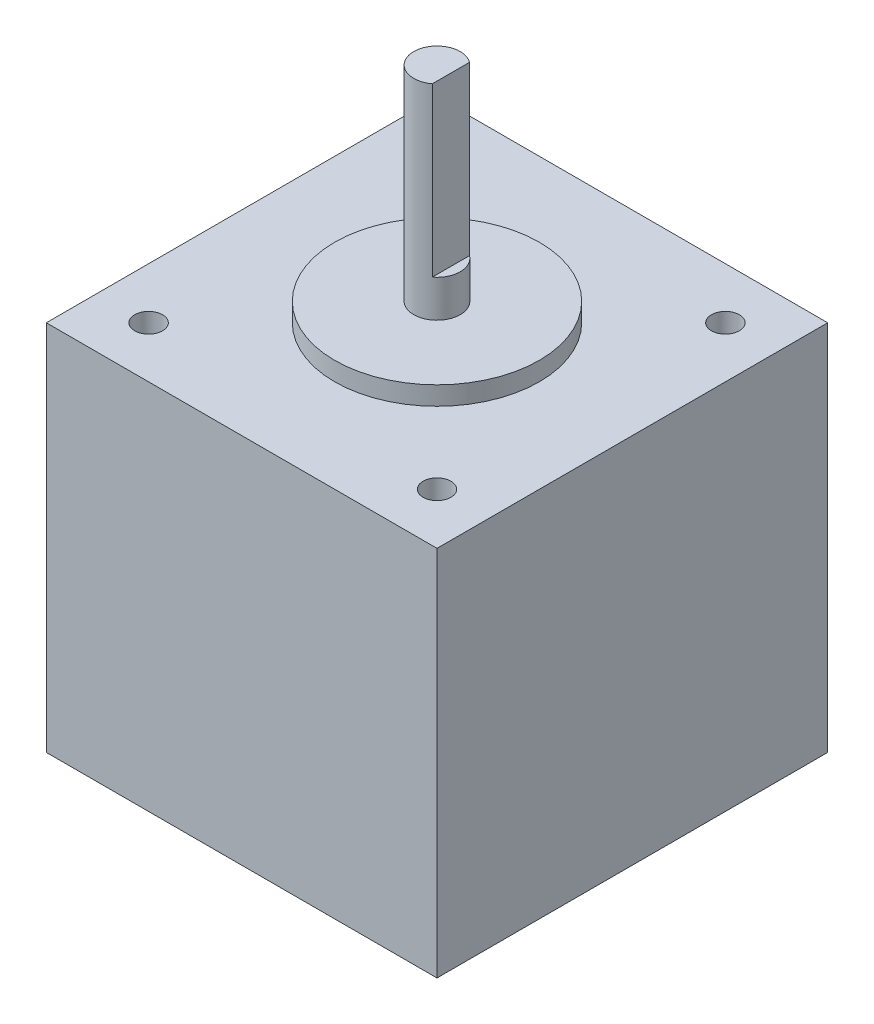
ISO-10303-21;
HEADER;
FILE_DESCRIPTION(('STEP AP214'),'2;1');
FILE_NAME('part.step','',(''),(''),'','','');
FILE_SCHEMA(('AUTOMOTIVE_DESIGN { 1 0 10303 214 1 1 1 1 }'));
ENDSEC;
DATA;
#1=APPLICATION_CONTEXT('core data for automotive mechanical design processes');
#2=APPLICATION_PROTOCOL_DEFINITION('international standard','automotive_design',2000,#1);
#3=PRODUCT_CONTEXT('',#1,'mechanical');
#4=PRODUCT('Part','Part','',(#3));
#5=PRODUCT_RELATED_PRODUCT_CATEGORY('part','',(#4));
#6=PRODUCT_DEFINITION_FORMATION('','',#4);
#7=PRODUCT_DEFINITION_CONTEXT('part definition',#1,'design');
#8=PRODUCT_DEFINITION('design','',#6,#7);
#9=PRODUCT_DEFINITION_SHAPE('','',#8);
#10=(LENGTH_UNIT() NAMED_UNIT(*) SI_UNIT(.MILLI.,.METRE.));
#11=(NAMED_UNIT(*) PLANE_ANGLE_UNIT() SI_UNIT($,.RADIAN.));
#12=(NAMED_UNIT(*) SI_UNIT($,.STERADIAN.) SOLID_ANGLE_UNIT());
#13=UNCERTAINTY_MEASURE_WITH_UNIT(LENGTH_MEASURE(1.E-05),#10,'distance_accuracy_value','');
#14=(GEOMETRIC_REPRESENTATION_CONTEXT(3) GLOBAL_UNCERTAINTY_ASSIGNED_CONTEXT((#13)) GLOBAL_UNIT_ASSIGNED_CONTEXT((#10,
#11,#12)) REPRESENTATION_CONTEXT('',''));
#15=CARTESIAN_POINT('',(0.,0.,0.));
#16=DIRECTION('',(0.,0.,1.));
#17=DIRECTION('',(1.,0.,0.));
#18=AXIS2_PLACEMENT_3D('',#15,#16,#17);
#19=CARTESIAN_POINT('',(21.,64.,-21.));
#20=DIRECTION('',(0.,-1.,0.));
#21=DIRECTION('',(0.,0.,-1.));
#22=AXIS2_PLACEMENT_3D('',#19,#20,#21);
#23=CYLINDRICAL_SURFACE('',#22,2.5);
#24=CARTESIAN_POINT('',(21.,42.,-21.));
#25=DIRECTION('',(0.,1.,0.));
#26=DIRECTION('',(0.,0.,1.));
#27=AXIS2_PLACEMENT_3D('',#24,#25,#26);
#28=CIRCLE('',#27,2.5);
#29=CARTESIAN_POINT('',(21.,42.,-18.5));
#30=VERTEX_POINT('',#29);
#31=EDGE_CURVE('E11',#30,#30,#28,.T.);
#32=ORIENTED_EDGE('',*,*,#31,.T.);
#33=EDGE_LOOP('',(#32));
#34=FACE_BOUND('',#33,.T.);
#35=DIRECTION('',(0.,1.,0.));
#36=VECTOR('',#35,1.);
#37=CARTESIAN_POINT('',(22.5,46.,-19.));
#38=LINE('',#37,#36);
#39=CARTESIAN_POINT('',(22.5,46.,-19.));
#40=VERTEX_POINT('',#39);
#41=CARTESIAN_POINT('',(22.5,64.,-19.));
#42=VERTEX_POINT('',#41);
#43=EDGE_CURVE('E103',#40,#42,#38,.T.);
#44=ORIENTED_EDGE('',*,*,#43,.T.);
#45=CARTESIAN_POINT('',(21.,64.,-21.));
#46=DIRECTION('',(0.,1.,0.));
#47=DIRECTION('',(0.,0.,1.));
#48=AXIS2_PLACEMENT_3D('',#45,#46,#47);
#49=CIRCLE('',#48,2.5);
#50=CARTESIAN_POINT('',(22.5,64.,-23.));
#51=VERTEX_POINT('',#50);
#52=EDGE_CURVE('E126',#51,#42,#49,.T.);
#53=ORIENTED_EDGE('',*,*,#52,.F.);
#54=DIRECTION('',(0.,1.,0.));
#55=VECTOR('',#54,1.);
#56=CARTESIAN_POINT('',(22.5,46.,-23.));
#57=LINE('',#56,#55);
#58=CARTESIAN_POINT('',(22.5,46.,-23.));
#59=VERTEX_POINT('',#58);
#60=EDGE_CURVE('E57',#59,#51,#57,.T.);
#61=ORIENTED_EDGE('',*,*,#60,.F.);
#62=CARTESIAN_POINT('',(21.,46.,-21.));
#63=DIRECTION('',(0.,1.,0.));
#64=DIRECTION('',(0.,0.,1.));
#65=AXIS2_PLACEMENT_3D('',#62,#63,#64);
#66=CIRCLE('',#65,2.5);
#67=EDGE_CURVE('E114',#40,#59,#66,.T.);
#68=ORIENTED_EDGE('',*,*,#67,.F.);
#69=EDGE_LOOP('',(#44,#53,#61,#68));
#70=FACE_BOUND('',#69,.T.);
#71=ADVANCED_FACE('F39',(#34,#70),#23,.T.);
#72=CARTESIAN_POINT('',(21.,64.,-21.));
#73=DIRECTION('',(0.,1.,0.));
#74=DIRECTION('',(0.,0.,1.));
#75=AXIS2_PLACEMENT_3D('',#72,#73,#74);
#76=PLANE('',#75);
#77=ORIENTED_EDGE('',*,*,#52,.T.);
#78=DIRECTION('',(0.,0.,-1.));
#79=VECTOR('',#78,1.);
#80=CARTESIAN_POINT('',(22.5,64.,0.));
#81=LINE('',#80,#79);
#82=EDGE_CURVE('E108',#42,#51,#81,.T.);
#83=ORIENTED_EDGE('',*,*,#82,.T.);
#84=EDGE_LOOP('',(#77,#83));
#85=FACE_BOUND('',#84,.T.);
#86=ADVANCED_FACE('F228',(#85),#76,.T.);
#87=CARTESIAN_POINT('',(42.,40.,0.));
#88=DIRECTION('',(0.,0.,-1.));
#89=DIRECTION('',(-1.,0.,0.));
#90=AXIS2_PLACEMENT_3D('',#87,#88,#89);
#91=PLANE('',#90);
#92=DIRECTION('',(1.,0.,0.));
#93=VECTOR('',#92,1.);
#94=CARTESIAN_POINT('',(42.,0.,0.));
#95=LINE('',#94,#93);
#96=CARTESIAN_POINT('',(0.,0.,0.));
#97=VERTEX_POINT('',#96);
#98=CARTESIAN_POINT('',(42.,0.,0.));
#99=VERTEX_POINT('',#98);
#100=EDGE_CURVE('E166',#97,#99,#95,.T.);
#101=ORIENTED_EDGE('',*,*,#100,.T.);
#102=DIRECTION('',(0.,-1.,0.));
#103=VECTOR('',#102,1.);
#104=CARTESIAN_POINT('',(42.,40.,0.));
#105=LINE('',#104,#103);
#106=CARTESIAN_POINT('',(42.,40.,0.));
#107=VERTEX_POINT('',#106);
#108=EDGE_CURVE('E43',#107,#99,#105,.T.);
#109=ORIENTED_EDGE('',*,*,#108,.F.);
#110=DIRECTION('',(1.,0.,0.));
#111=VECTOR('',#110,1.);
#112=CARTESIAN_POINT('',(42.,40.,0.));
#113=LINE('',#112,#111);
#114=CARTESIAN_POINT('',(0.,40.,0.));
#115=VERTEX_POINT('',#114);
#116=EDGE_CURVE('E170',#115,#107,#113,.T.);
#117=ORIENTED_EDGE('',*,*,#116,.F.);
#118=DIRECTION('',(0.,-1.,0.));
#119=VECTOR('',#118,1.);
#120=CARTESIAN_POINT('',(0.,40.,0.));
#121=LINE('',#120,#119);
#122=EDGE_CURVE('E180',#115,#97,#121,.T.);
#123=ORIENTED_EDGE('',*,*,#122,.T.);
#124=EDGE_LOOP('',(#101,#109,#117,#123));
#125=FACE_BOUND('',#124,.T.);
#126=ADVANCED_FACE('F41',(#125),#91,.F.);
#127=CARTESIAN_POINT('',(42.,40.,-42.));
#128=DIRECTION('',(-1.,0.,0.));
#129=DIRECTION('',(0.,0.,1.));
#130=AXIS2_PLACEMENT_3D('',#127,#128,#129);
#131=PLANE('',#130);
#132=DIRECTION('',(0.,0.,-1.));
#133=VECTOR('',#132,1.);
#134=CARTESIAN_POINT('',(42.,0.,-42.));
#135=LINE('',#134,#133);
#136=CARTESIAN_POINT('',(42.,0.,-42.));
#137=VERTEX_POINT('',#136);
#138=EDGE_CURVE('E184',#99,#137,#135,.T.);
#139=ORIENTED_EDGE('',*,*,#138,.T.);
#140=DIRECTION('',(0.,-1.,0.));
#141=VECTOR('',#140,1.);
#142=CARTESIAN_POINT('',(42.,40.,-42.));
#143=LINE('',#142,#141);
#144=CARTESIAN_POINT('',(42.,40.,-42.));
#145=VERTEX_POINT('',#144);
#146=EDGE_CURVE('E196',#145,#137,#143,.T.);
#147=ORIENTED_EDGE('',*,*,#146,.F.);
#148=DIRECTION('',(0.,0.,-1.));
#149=VECTOR('',#148,1.);
#150=CARTESIAN_POINT('',(42.,40.,-42.));
#151=LINE('',#150,#149);
#152=EDGE_CURVE('E95',#107,#145,#151,.T.);
#153=ORIENTED_EDGE('',*,*,#152,.F.);
#154=ORIENTED_EDGE('',*,*,#108,.T.);
#155=EDGE_LOOP('',(#139,#147,#153,#154));
#156=FACE_BOUND('',#155,.T.);
#157=ADVANCED_FACE('F204',(#156),#131,.F.);
#158=CARTESIAN_POINT('',(0.,40.,-42.));
#159=DIRECTION('',(0.,0.,1.));
#160=DIRECTION('',(1.,0.,0.));
#161=AXIS2_PLACEMENT_3D('',#158,#159,#160);
#162=PLANE('',#161);
#163=DIRECTION('',(-1.,0.,0.));
#164=VECTOR('',#163,1.);
#165=CARTESIAN_POINT('',(0.,0.,-42.));
#166=LINE('',#165,#164);
#167=CARTESIAN_POINT('',(0.,0.,-42.));
#168=VERTEX_POINT('',#167);
#169=EDGE_CURVE('E187',#137,#168,#166,.T.);
#170=ORIENTED_EDGE('',*,*,#169,.T.);
#171=DIRECTION('',(0.,-1.,0.));
#172=VECTOR('',#171,1.);
#173=CARTESIAN_POINT('',(0.,40.,-42.));
#174=LINE('',#173,#172);
#175=CARTESIAN_POINT('',(0.,40.,-42.));
#176=VERTEX_POINT('',#175);
#177=EDGE_CURVE('E194',#176,#168,#174,.T.);
#178=ORIENTED_EDGE('',*,*,#177,.F.);
#179=DIRECTION('',(-1.,0.,0.));
#180=VECTOR('',#179,1.);
#181=CARTESIAN_POINT('',(0.,40.,-42.));
#182=LINE('',#181,#180);
#183=EDGE_CURVE('E175',#145,#176,#182,.T.);
#184=ORIENTED_EDGE('',*,*,#183,.F.);
#185=ORIENTED_EDGE('',*,*,#146,.T.);
#186=EDGE_LOOP('',(#170,#178,#184,#185));
#187=FACE_BOUND('',#186,.T.);
#188=ADVANCED_FACE('F211',(#187),#162,.F.);
#189=CARTESIAN_POINT('',(0.,40.,0.));
#190=DIRECTION('',(1.,0.,0.));
#191=DIRECTION('',(0.,0.,-1.));
#192=AXIS2_PLACEMENT_3D('',#189,#190,#191);
#193=PLANE('',#192);
#194=DIRECTION('',(0.,0.,1.));
#195=VECTOR('',#194,1.);
#196=CARTESIAN_POINT('',(0.,0.,0.));
#197=LINE('',#196,#195);
#198=EDGE_CURVE('E87',#168,#97,#197,.T.);
#199=ORIENTED_EDGE('',*,*,#198,.T.);
#200=ORIENTED_EDGE('',*,*,#122,.F.);
#201=DIRECTION('',(0.,0.,1.));
#202=VECTOR('',#201,1.);
#203=CARTESIAN_POINT('',(0.,40.,0.));
#204=LINE('',#203,#202);
#205=EDGE_CURVE('E66',#176,#115,#204,.T.);
#206=ORIENTED_EDGE('',*,*,#205,.F.);
#207=ORIENTED_EDGE('',*,*,#177,.T.);
#208=EDGE_LOOP('',(#199,#200,#206,#207));
#209=FACE_BOUND('',#208,.T.);
#210=ADVANCED_FACE('F212',(#209),#193,.F.);
#211=CARTESIAN_POINT('',(0.,40.,0.));
#212=DIRECTION('',(0.,-1.,0.));
#213=DIRECTION('',(0.,0.,-1.));
#214=AXIS2_PLACEMENT_3D('',#211,#212,#213);
#215=PLANE('',#214);
#216=CARTESIAN_POINT('',(5.50000000000001,40.,-5.50000000000001));
#217=DIRECTION('',(0.,-1.,0.));
#218=DIRECTION('',(0.,0.,-1.));
#219=AXIS2_PLACEMENT_3D('',#216,#217,#218);
#220=CIRCLE('',#219,1.5);
#221=CARTESIAN_POINT('',(5.50000000000001,40.,-7.00000000000001));
#222=VERTEX_POINT('',#221);
#223=EDGE_CURVE('E148',#222,#222,#220,.T.);
#224=ORIENTED_EDGE('',*,*,#223,.T.);
#225=EDGE_LOOP('',(#224));
#226=FACE_BOUND('',#225,.T.);
#227=CARTESIAN_POINT('',(36.5,40.,-5.50000000000001));
#228=DIRECTION('',(0.,-1.,0.));
#229=DIRECTION('',(0.,0.,-1.));
#230=AXIS2_PLACEMENT_3D('',#227,#228,#229);
#231=CIRCLE('',#230,1.5);
#232=CARTESIAN_POINT('',(36.5,40.,-7.00000000000001));
#233=VERTEX_POINT('',#232);
#234=EDGE_CURVE('E140',#233,#233,#231,.T.);
#235=ORIENTED_EDGE('',*,*,#234,.T.);
#236=EDGE_LOOP('',(#235));
#237=FACE_BOUND('',#236,.T.);
#238=CARTESIAN_POINT('',(36.5,40.,-36.5));
#239=DIRECTION('',(0.,-1.,0.));
#240=DIRECTION('',(0.,0.,-1.));
#241=AXIS2_PLACEMENT_3D('',#238,#239,#240);
#242=CIRCLE('',#241,1.5);
#243=CARTESIAN_POINT('',(36.5,40.,-38.));
#244=VERTEX_POINT('',#243);
#245=EDGE_CURVE('E131',#244,#244,#242,.T.);
#246=ORIENTED_EDGE('',*,*,#245,.T.);
#247=EDGE_LOOP('',(#246));
#248=FACE_BOUND('',#247,.T.);
#249=CARTESIAN_POINT('',(5.50000000000001,40.,-36.5));
#250=DIRECTION('',(0.,-1.,0.));
#251=DIRECTION('',(0.,0.,-1.));
#252=AXIS2_PLACEMENT_3D('',#249,#250,#251);
#253=CIRCLE('',#252,1.5);
#254=CARTESIAN_POINT('',(5.50000000000001,40.,-38.));
#255=VERTEX_POINT('',#254);
#256=EDGE_CURVE('E155',#255,#255,#253,.T.);
#257=ORIENTED_EDGE('',*,*,#256,.T.);
#258=EDGE_LOOP('',(#257));
#259=FACE_BOUND('',#258,.T.);
#260=CARTESIAN_POINT('',(21.,40.,-21.));
#261=DIRECTION('',(0.,1.,0.));
#262=DIRECTION('',(0.,0.,1.));
#263=AXIS2_PLACEMENT_3D('',#260,#261,#262);
#264=CIRCLE('',#263,11.);
#265=CARTESIAN_POINT('',(21.,40.,-10.));
#266=VERTEX_POINT('',#265);
#267=EDGE_CURVE('E49',#266,#266,#264,.T.);
#268=ORIENTED_EDGE('',*,*,#267,.F.);
#269=EDGE_LOOP('',(#268));
#270=FACE_BOUND('',#269,.T.);
#271=ORIENTED_EDGE('',*,*,#116,.T.);
#272=ORIENTED_EDGE('',*,*,#152,.T.);
#273=ORIENTED_EDGE('',*,*,#183,.T.);
#274=ORIENTED_EDGE('',*,*,#205,.T.);
#275=EDGE_LOOP('',(#271,#272,#273,#274));
#276=FACE_BOUND('',#275,.T.);
#277=ADVANCED_FACE('F213',(#226,#237,#248,#259,#270,#276),#215,.F.);
#278=CARTESIAN_POINT('',(0.,0.,0.));
#279=DIRECTION('',(0.,-1.,0.));
#280=DIRECTION('',(0.,0.,-1.));
#281=AXIS2_PLACEMENT_3D('',#278,#279,#280);
#282=PLANE('',#281);
#283=CARTESIAN_POINT('',(5.50000000000001,0.,-5.50000000000001));
#284=DIRECTION('',(0.,-1.,0.));
#285=DIRECTION('',(0.,0.,-1.));
#286=AXIS2_PLACEMENT_3D('',#283,#284,#285);
#287=CIRCLE('',#286,1.5);
#288=CARTESIAN_POINT('',(5.50000000000001,0.,-7.00000000000001));
#289=VERTEX_POINT('',#288);
#290=EDGE_CURVE('E129',#289,#289,#287,.T.);
#291=ORIENTED_EDGE('',*,*,#290,.F.);
#292=EDGE_LOOP('',(#291));
#293=FACE_BOUND('',#292,.T.);
#294=CARTESIAN_POINT('',(36.5,0.,-5.50000000000001));
#295=DIRECTION('',(0.,-1.,0.));
#296=DIRECTION('',(0.,0.,-1.));
#297=AXIS2_PLACEMENT_3D('',#294,#295,#296);
#298=CIRCLE('',#297,1.5);
#299=CARTESIAN_POINT('',(36.5,0.,-7.00000000000001));
#300=VERTEX_POINT('',#299);
#301=EDGE_CURVE('E144',#300,#300,#298,.T.);
#302=ORIENTED_EDGE('',*,*,#301,.F.);
#303=EDGE_LOOP('',(#302));
#304=FACE_BOUND('',#303,.T.);
#305=CARTESIAN_POINT('',(36.5,0.,-36.5));
#306=DIRECTION('',(0.,-1.,0.));
#307=DIRECTION('',(0.,0.,-1.));
#308=AXIS2_PLACEMENT_3D('',#305,#306,#307);
#309=CIRCLE('',#308,1.5);
#310=CARTESIAN_POINT('',(36.5,0.,-38.));
#311=VERTEX_POINT('',#310);
#312=EDGE_CURVE('E136',#311,#311,#309,.T.);
#313=ORIENTED_EDGE('',*,*,#312,.F.);
#314=EDGE_LOOP('',(#313));
#315=FACE_BOUND('',#314,.T.);
#316=CARTESIAN_POINT('',(5.50000000000001,0.,-36.5));
#317=DIRECTION('',(0.,-1.,0.));
#318=DIRECTION('',(0.,0.,-1.));
#319=AXIS2_PLACEMENT_3D('',#316,#317,#318);
#320=CIRCLE('',#319,1.5);
#321=CARTESIAN_POINT('',(5.50000000000001,0.,-38.));
#322=VERTEX_POINT('',#321);
#323=EDGE_CURVE('E135',#322,#322,#320,.T.);
#324=ORIENTED_EDGE('',*,*,#323,.F.);
#325=EDGE_LOOP('',(#324));
#326=FACE_BOUND('',#325,.T.);
#327=ORIENTED_EDGE('',*,*,#100,.F.);
#328=ORIENTED_EDGE('',*,*,#198,.F.);
#329=ORIENTED_EDGE('',*,*,#169,.F.);
#330=ORIENTED_EDGE('',*,*,#138,.F.);
#331=EDGE_LOOP('',(#327,#328,#329,#330));
#332=FACE_BOUND('',#331,.T.);
#333=ADVANCED_FACE('F209',(#293,#304,#315,#326,#332),#282,.T.);
#334=CARTESIAN_POINT('',(21.,42.,-21.));
#335=DIRECTION('',(0.,-1.,0.));
#336=DIRECTION('',(0.,0.,-1.));
#337=AXIS2_PLACEMENT_3D('',#334,#335,#336);
#338=CYLINDRICAL_SURFACE('',#337,11.);
#339=CARTESIAN_POINT('',(21.,42.,-21.));
#340=DIRECTION('',(0.,1.,0.));
#341=DIRECTION('',(0.,0.,1.));
#342=AXIS2_PLACEMENT_3D('',#339,#340,#341);
#343=CIRCLE('',#342,11.);
#344=CARTESIAN_POINT('',(21.,42.,-10.));
#345=VERTEX_POINT('',#344);
#346=EDGE_CURVE('E159',#345,#345,#343,.T.);
#347=ORIENTED_EDGE('',*,*,#346,.F.);
#348=EDGE_LOOP('',(#347));
#349=FACE_BOUND('',#348,.T.);
#350=ORIENTED_EDGE('',*,*,#267,.T.);
#351=EDGE_LOOP('',(#350));
#352=FACE_BOUND('',#351,.T.);
#353=ADVANCED_FACE('F221',(#349,#352),#338,.T.);
#354=CARTESIAN_POINT('',(21.,42.,-21.));
#355=DIRECTION('',(0.,1.,0.));
#356=DIRECTION('',(0.,0.,1.));
#357=AXIS2_PLACEMENT_3D('',#354,#355,#356);
#358=PLANE('',#357);
#359=ORIENTED_EDGE('',*,*,#31,.F.);
#360=EDGE_LOOP('',(#359));
#361=FACE_BOUND('',#360,.T.);
#362=ORIENTED_EDGE('',*,*,#346,.T.);
#363=EDGE_LOOP('',(#362));
#364=FACE_BOUND('',#363,.T.);
#365=ADVANCED_FACE('F253',(#361,#364),#358,.T.);
#366=CARTESIAN_POINT('',(5.50000000000001,40.,-36.5));
#367=DIRECTION('',(0.,-1.,0.));
#368=DIRECTION('',(0.,0.,-1.));
#369=AXIS2_PLACEMENT_3D('',#366,#367,#368);
#370=CYLINDRICAL_SURFACE('',#369,1.5);
#371=ORIENTED_EDGE('',*,*,#256,.F.);
#372=EDGE_LOOP('',(#371));
#373=FACE_BOUND('',#372,.T.);
#374=ORIENTED_EDGE('',*,*,#323,.T.);
#375=EDGE_LOOP('',(#374));
#376=FACE_BOUND('',#375,.T.);
#377=ADVANCED_FACE('F242',(#373,#376),#370,.F.);
#378=CARTESIAN_POINT('',(36.5,40.,-36.5));
#379=DIRECTION('',(0.,-1.,0.));
#380=DIRECTION('',(0.,0.,-1.));
#381=AXIS2_PLACEMENT_3D('',#378,#379,#380);
#382=CYLINDRICAL_SURFACE('',#381,1.5);
#383=ORIENTED_EDGE('',*,*,#245,.F.);
#384=EDGE_LOOP('',(#383));
#385=FACE_BOUND('',#384,.T.);
#386=ORIENTED_EDGE('',*,*,#312,.T.);
#387=EDGE_LOOP('',(#386));
#388=FACE_BOUND('',#387,.T.);
#389=ADVANCED_FACE('F238',(#385,#388),#382,.F.);
#390=CARTESIAN_POINT('',(36.5,40.,-5.50000000000001));
#391=DIRECTION('',(0.,-1.,0.));
#392=DIRECTION('',(0.,0.,-1.));
#393=AXIS2_PLACEMENT_3D('',#390,#391,#392);
#394=CYLINDRICAL_SURFACE('',#393,1.5);
#395=ORIENTED_EDGE('',*,*,#234,.F.);
#396=EDGE_LOOP('',(#395));
#397=FACE_BOUND('',#396,.T.);
#398=ORIENTED_EDGE('',*,*,#301,.T.);
#399=EDGE_LOOP('',(#398));
#400=FACE_BOUND('',#399,.T.);
#401=ADVANCED_FACE('F241',(#397,#400),#394,.F.);
#402=CARTESIAN_POINT('',(5.50000000000001,40.,-5.50000000000001));
#403=DIRECTION('',(0.,-1.,0.));
#404=DIRECTION('',(0.,0.,-1.));
#405=AXIS2_PLACEMENT_3D('',#402,#403,#404);
#406=CYLINDRICAL_SURFACE('',#405,1.5);
#407=ORIENTED_EDGE('',*,*,#223,.F.);
#408=EDGE_LOOP('',(#407));
#409=FACE_BOUND('',#408,.T.);
#410=ORIENTED_EDGE('',*,*,#290,.T.);
#411=EDGE_LOOP('',(#410));
#412=FACE_BOUND('',#411,.T.);
#413=ADVANCED_FACE('F246',(#409,#412),#406,.F.);
#414=CARTESIAN_POINT('',(22.5,46.,0.));
#415=DIRECTION('',(1.,0.,0.));
#416=DIRECTION('',(0.,0.,-1.));
#417=AXIS2_PLACEMENT_3D('',#414,#415,#416);
#418=PLANE('',#417);
#419=ORIENTED_EDGE('',*,*,#82,.F.);
#420=ORIENTED_EDGE('',*,*,#43,.F.);
#421=DIRECTION('',(0.,0.,-1.));
#422=VECTOR('',#421,1.);
#423=CARTESIAN_POINT('',(22.5,46.,0.));
#424=LINE('',#423,#422);
#425=EDGE_CURVE('E106',#40,#59,#424,.T.);
#426=ORIENTED_EDGE('',*,*,#425,.T.);
#427=ORIENTED_EDGE('',*,*,#60,.T.);
#428=EDGE_LOOP('',(#419,#420,#426,#427));
#429=FACE_BOUND('',#428,.T.);
#430=ADVANCED_FACE('F105',(#429),#418,.T.);
#431=CARTESIAN_POINT('',(0.,46.,0.));
#432=DIRECTION('',(0.,1.,0.));
#433=DIRECTION('',(0.,0.,1.));
#434=AXIS2_PLACEMENT_3D('',#431,#432,#433);
#435=PLANE('',#434);
#436=ORIENTED_EDGE('',*,*,#425,.F.);
#437=ORIENTED_EDGE('',*,*,#67,.T.);
#438=EDGE_LOOP('',(#436,#437));
#439=FACE_BOUND('',#438,.T.);
#440=ADVANCED_FACE('F117',(#439),#435,.T.);
#441=CLOSED_SHELL('',(#71,#86,#126,#157,#188,#210,#277,#333,#353,#365,#377,#389,#401,#413,#430,#440));
#442=MANIFOLD_SOLID_BREP('B2',#441);
#443=ADVANCED_BREP_SHAPE_REPRESENTATION('',(#18,#442),#14);
#444=SHAPE_DEFINITION_REPRESENTATION(#9,#443);
ENDSEC;
END-ISO-10303-21;
